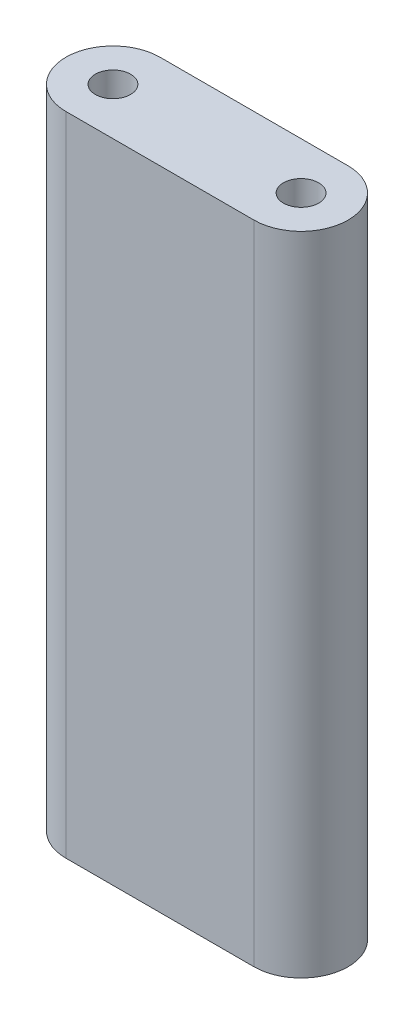
ISO-10303-21;
HEADER;
FILE_DESCRIPTION(('STEP AP214'),'2;1');
FILE_NAME('part.step','',(''),(''),'','','');
FILE_SCHEMA(('AUTOMOTIVE_DESIGN { 1 0 10303 214 1 1 1 1 }'));
ENDSEC;
DATA;
#1=APPLICATION_CONTEXT('core data for automotive mechanical design processes');
#2=APPLICATION_PROTOCOL_DEFINITION('international standard','automotive_design',2000,#1);
#3=PRODUCT_CONTEXT('',#1,'mechanical');
#4=PRODUCT('Part','Part','',(#3));
#5=PRODUCT_RELATED_PRODUCT_CATEGORY('part','',(#4));
#6=PRODUCT_DEFINITION_FORMATION('','',#4);
#7=PRODUCT_DEFINITION_CONTEXT('part definition',#1,'design');
#8=PRODUCT_DEFINITION('design','',#6,#7);
#9=PRODUCT_DEFINITION_SHAPE('','',#8);
#10=(LENGTH_UNIT() NAMED_UNIT(*) SI_UNIT(.MILLI.,.METRE.));
#11=(NAMED_UNIT(*) PLANE_ANGLE_UNIT() SI_UNIT($,.RADIAN.));
#12=(NAMED_UNIT(*) SI_UNIT($,.STERADIAN.) SOLID_ANGLE_UNIT());
#13=UNCERTAINTY_MEASURE_WITH_UNIT(LENGTH_MEASURE(1.E-05),#10,'distance_accuracy_value','');
#14=(GEOMETRIC_REPRESENTATION_CONTEXT(3) GLOBAL_UNCERTAINTY_ASSIGNED_CONTEXT((#13)) GLOBAL_UNIT_ASSIGNED_CONTEXT((#10,
#11,#12)) REPRESENTATION_CONTEXT('',''));
#15=CARTESIAN_POINT('',(0.,0.,0.));
#16=DIRECTION('',(0.,0.,1.));
#17=DIRECTION('',(1.,0.,0.));
#18=AXIS2_PLACEMENT_3D('',#15,#16,#17);
#19=CARTESIAN_POINT('',(-10.3736217176902,55.,0.));
#20=DIRECTION('',(0.,1.,0.));
#21=DIRECTION('',(0.,0.,1.));
#22=AXIS2_PLACEMENT_3D('',#19,#20,#21);
#23=PLANE('',#22);
#24=CARTESIAN_POINT('',(-10.3736217176902,55.,0.));
#25=DIRECTION('',(0.,1.,0.));
#26=DIRECTION('',(0.,0.,1.));
#27=AXIS2_PLACEMENT_3D('',#24,#25,#26);
#28=CIRCLE('',#27,1.5);
#29=CARTESIAN_POINT('',(-10.3736217176902,55.,1.5));
#30=VERTEX_POINT('',#29);
#31=EDGE_CURVE('E103',#30,#30,#28,.T.);
#32=ORIENTED_EDGE('',*,*,#31,.F.);
#33=EDGE_LOOP('',(#32));
#34=FACE_BOUND('',#33,.T.);
#35=CARTESIAN_POINT('',(-10.3736217176902,55.,0.));
#36=DIRECTION('',(0.,1.,0.));
#37=DIRECTION('',(0.,0.,1.));
#38=AXIS2_PLACEMENT_3D('',#35,#36,#37);
#39=CIRCLE('',#38,4.);
#40=CARTESIAN_POINT('',(-10.3736217176902,55.,-4.));
#41=VERTEX_POINT('',#40);
#42=CARTESIAN_POINT('',(-10.3736217176902,55.,4.));
#43=VERTEX_POINT('',#42);
#44=EDGE_CURVE('E88',#41,#43,#39,.T.);
#45=ORIENTED_EDGE('',*,*,#44,.T.);
#46=DIRECTION('',(1.,0.,0.));
#47=VECTOR('',#46,1.);
#48=CARTESIAN_POINT('',(-10.3736217176902,55.,4.));
#49=LINE('',#48,#47);
#50=CARTESIAN_POINT('',(5.62637828230982,55.,4.));
#51=VERTEX_POINT('',#50);
#52=EDGE_CURVE('E83',#43,#51,#49,.T.);
#53=ORIENTED_EDGE('',*,*,#52,.T.);
#54=CARTESIAN_POINT('',(5.62637828230982,55.,0.));
#55=DIRECTION('',(0.,1.,0.));
#56=DIRECTION('',(0.,0.,1.));
#57=AXIS2_PLACEMENT_3D('',#54,#55,#56);
#58=CIRCLE('',#57,4.);
#59=CARTESIAN_POINT('',(5.62637828230982,55.,-4.));
#60=VERTEX_POINT('',#59);
#61=EDGE_CURVE('E86',#51,#60,#58,.T.);
#62=ORIENTED_EDGE('',*,*,#61,.T.);
#63=DIRECTION('',(-1.,0.,0.));
#64=VECTOR('',#63,1.);
#65=CARTESIAN_POINT('',(-10.3736217176902,55.,-4.));
#66=LINE('',#65,#64);
#67=EDGE_CURVE('E53',#60,#41,#66,.T.);
#68=ORIENTED_EDGE('',*,*,#67,.T.);
#69=EDGE_LOOP('',(#45,#53,#62,#68));
#70=FACE_BOUND('',#69,.T.);
#71=CARTESIAN_POINT('',(5.62637828230982,55.,0.));
#72=DIRECTION('',(0.,1.,0.));
#73=DIRECTION('',(0.,0.,1.));
#74=AXIS2_PLACEMENT_3D('',#71,#72,#73);
#75=CIRCLE('',#74,1.5);
#76=CARTESIAN_POINT('',(5.62637828230982,55.,1.5));
#77=VERTEX_POINT('',#76);
#78=EDGE_CURVE('E118',#77,#77,#75,.T.);
#79=ORIENTED_EDGE('',*,*,#78,.F.);
#80=EDGE_LOOP('',(#79));
#81=FACE_BOUND('',#80,.T.);
#82=ADVANCED_FACE('F36',(#34,#70,#81),#23,.T.);
#83=CARTESIAN_POINT('',(-10.3736217176902,0.,0.));
#84=DIRECTION('',(0.,1.,0.));
#85=DIRECTION('',(0.,0.,1.));
#86=AXIS2_PLACEMENT_3D('',#83,#84,#85);
#87=PLANE('',#86);
#88=CARTESIAN_POINT('',(-10.3736217176902,0.,0.));
#89=DIRECTION('',(0.,1.,0.));
#90=DIRECTION('',(0.,0.,1.));
#91=AXIS2_PLACEMENT_3D('',#88,#89,#90);
#92=CIRCLE('',#91,4.);
#93=CARTESIAN_POINT('',(-10.3736217176902,0.,-4.));
#94=VERTEX_POINT('',#93);
#95=CARTESIAN_POINT('',(-10.3736217176902,0.,4.));
#96=VERTEX_POINT('',#95);
#97=EDGE_CURVE('E100',#94,#96,#92,.T.);
#98=ORIENTED_EDGE('',*,*,#97,.F.);
#99=DIRECTION('',(-1.,0.,0.));
#100=VECTOR('',#99,1.);
#101=CARTESIAN_POINT('',(-10.3736217176902,0.,-4.));
#102=LINE('',#101,#100);
#103=CARTESIAN_POINT('',(5.62637828230982,0.,-4.));
#104=VERTEX_POINT('',#103);
#105=EDGE_CURVE('E76',#104,#94,#102,.T.);
#106=ORIENTED_EDGE('',*,*,#105,.F.);
#107=CARTESIAN_POINT('',(5.62637828230982,0.,0.));
#108=DIRECTION('',(0.,1.,0.));
#109=DIRECTION('',(0.,0.,1.));
#110=AXIS2_PLACEMENT_3D('',#107,#108,#109);
#111=CIRCLE('',#110,4.);
#112=CARTESIAN_POINT('',(5.62637828230982,0.,4.));
#113=VERTEX_POINT('',#112);
#114=EDGE_CURVE('E70',#113,#104,#111,.T.);
#115=ORIENTED_EDGE('',*,*,#114,.F.);
#116=DIRECTION('',(1.,0.,0.));
#117=VECTOR('',#116,1.);
#118=CARTESIAN_POINT('',(-10.3736217176902,0.,4.));
#119=LINE('',#118,#117);
#120=EDGE_CURVE('E92',#96,#113,#119,.T.);
#121=ORIENTED_EDGE('',*,*,#120,.F.);
#122=EDGE_LOOP('',(#98,#106,#115,#121));
#123=FACE_BOUND('',#122,.T.);
#124=CARTESIAN_POINT('',(-10.3736217176902,0.,0.));
#125=DIRECTION('',(0.,1.,0.));
#126=DIRECTION('',(0.,0.,1.));
#127=AXIS2_PLACEMENT_3D('',#124,#125,#126);
#128=CIRCLE('',#127,1.5);
#129=CARTESIAN_POINT('',(-10.3736217176902,0.,1.5));
#130=VERTEX_POINT('',#129);
#131=EDGE_CURVE('E115',#130,#130,#128,.T.);
#132=ORIENTED_EDGE('',*,*,#131,.T.);
#133=EDGE_LOOP('',(#132));
#134=FACE_BOUND('',#133,.T.);
#135=CARTESIAN_POINT('',(5.62637828230982,0.,0.));
#136=DIRECTION('',(0.,1.,0.));
#137=DIRECTION('',(0.,0.,1.));
#138=AXIS2_PLACEMENT_3D('',#135,#136,#137);
#139=CIRCLE('',#138,1.5);
#140=CARTESIAN_POINT('',(5.62637828230982,0.,1.5));
#141=VERTEX_POINT('',#140);
#142=EDGE_CURVE('E121',#141,#141,#139,.T.);
#143=ORIENTED_EDGE('',*,*,#142,.T.);
#144=EDGE_LOOP('',(#143));
#145=FACE_BOUND('',#144,.T.);
#146=ADVANCED_FACE('F111',(#123,#134,#145),#87,.F.);
#147=CARTESIAN_POINT('',(-10.3736217176902,55.,0.));
#148=DIRECTION('',(0.,-1.,0.));
#149=DIRECTION('',(0.,0.,-1.));
#150=AXIS2_PLACEMENT_3D('',#147,#148,#149);
#151=CYLINDRICAL_SURFACE('',#150,4.);
#152=ORIENTED_EDGE('',*,*,#97,.T.);
#153=DIRECTION('',(0.,-1.,0.));
#154=VECTOR('',#153,1.);
#155=CARTESIAN_POINT('',(-10.3736217176902,55.,4.));
#156=LINE('',#155,#154);
#157=EDGE_CURVE('E11',#43,#96,#156,.T.);
#158=ORIENTED_EDGE('',*,*,#157,.F.);
#159=ORIENTED_EDGE('',*,*,#44,.F.);
#160=DIRECTION('',(0.,-1.,0.));
#161=VECTOR('',#160,1.);
#162=CARTESIAN_POINT('',(-10.3736217176902,55.,-4.));
#163=LINE('',#162,#161);
#164=EDGE_CURVE('E96',#41,#94,#163,.T.);
#165=ORIENTED_EDGE('',*,*,#164,.T.);
#166=EDGE_LOOP('',(#152,#158,#159,#165));
#167=FACE_BOUND('',#166,.T.);
#168=ADVANCED_FACE('F38',(#167),#151,.T.);
#169=CARTESIAN_POINT('',(-10.3736217176902,55.,4.));
#170=DIRECTION('',(0.,0.,-1.));
#171=DIRECTION('',(-1.,0.,0.));
#172=AXIS2_PLACEMENT_3D('',#169,#170,#171);
#173=PLANE('',#172);
#174=ORIENTED_EDGE('',*,*,#120,.T.);
#175=DIRECTION('',(0.,-1.,0.));
#176=VECTOR('',#175,1.);
#177=CARTESIAN_POINT('',(5.62637828230982,55.,4.));
#178=LINE('',#177,#176);
#179=EDGE_CURVE('E45',#51,#113,#178,.T.);
#180=ORIENTED_EDGE('',*,*,#179,.F.);
#181=ORIENTED_EDGE('',*,*,#52,.F.);
#182=ORIENTED_EDGE('',*,*,#157,.T.);
#183=EDGE_LOOP('',(#174,#180,#181,#182));
#184=FACE_BOUND('',#183,.T.);
#185=ADVANCED_FACE('F91',(#184),#173,.F.);
#186=CARTESIAN_POINT('',(5.62637828230982,55.,0.));
#187=DIRECTION('',(0.,-1.,0.));
#188=DIRECTION('',(0.,0.,-1.));
#189=AXIS2_PLACEMENT_3D('',#186,#187,#188);
#190=CYLINDRICAL_SURFACE('',#189,4.);
#191=ORIENTED_EDGE('',*,*,#114,.T.);
#192=DIRECTION('',(0.,-1.,0.));
#193=VECTOR('',#192,1.);
#194=CARTESIAN_POINT('',(5.62637828230982,55.,-4.));
#195=LINE('',#194,#193);
#196=EDGE_CURVE('E93',#60,#104,#195,.T.);
#197=ORIENTED_EDGE('',*,*,#196,.F.);
#198=ORIENTED_EDGE('',*,*,#61,.F.);
#199=ORIENTED_EDGE('',*,*,#179,.T.);
#200=EDGE_LOOP('',(#191,#197,#198,#199));
#201=FACE_BOUND('',#200,.T.);
#202=ADVANCED_FACE('F94',(#201),#190,.T.);
#203=CARTESIAN_POINT('',(-10.3736217176902,55.,-4.));
#204=DIRECTION('',(0.,0.,1.));
#205=DIRECTION('',(1.,0.,0.));
#206=AXIS2_PLACEMENT_3D('',#203,#204,#205);
#207=PLANE('',#206);
#208=ORIENTED_EDGE('',*,*,#105,.T.);
#209=ORIENTED_EDGE('',*,*,#164,.F.);
#210=ORIENTED_EDGE('',*,*,#67,.F.);
#211=ORIENTED_EDGE('',*,*,#196,.T.);
#212=EDGE_LOOP('',(#208,#209,#210,#211));
#213=FACE_BOUND('',#212,.T.);
#214=ADVANCED_FACE('F108',(#213),#207,.F.);
#215=CARTESIAN_POINT('',(-10.3736217176902,55.,0.));
#216=DIRECTION('',(0.,-1.,0.));
#217=DIRECTION('',(0.,0.,-1.));
#218=AXIS2_PLACEMENT_3D('',#215,#216,#217);
#219=CYLINDRICAL_SURFACE('',#218,1.5);
#220=ORIENTED_EDGE('',*,*,#31,.T.);
#221=EDGE_LOOP('',(#220));
#222=FACE_BOUND('',#221,.T.);
#223=ORIENTED_EDGE('',*,*,#131,.F.);
#224=EDGE_LOOP('',(#223));
#225=FACE_BOUND('',#224,.T.);
#226=ADVANCED_FACE('F138',(#222,#225),#219,.F.);
#227=CARTESIAN_POINT('',(5.62637828230982,55.,0.));
#228=DIRECTION('',(0.,-1.,0.));
#229=DIRECTION('',(0.,0.,-1.));
#230=AXIS2_PLACEMENT_3D('',#227,#228,#229);
#231=CYLINDRICAL_SURFACE('',#230,1.5);
#232=ORIENTED_EDGE('',*,*,#78,.T.);
#233=EDGE_LOOP('',(#232));
#234=FACE_BOUND('',#233,.T.);
#235=ORIENTED_EDGE('',*,*,#142,.F.);
#236=EDGE_LOOP('',(#235));
#237=FACE_BOUND('',#236,.T.);
#238=ADVANCED_FACE('F127',(#234,#237),#231,.F.);
#239=CLOSED_SHELL('',(#82,#146,#168,#185,#202,#214,#226,#238));
#240=MANIFOLD_SOLID_BREP('B2',#239);
#241=ADVANCED_BREP_SHAPE_REPRESENTATION('',(#18,#240),#14);
#242=SHAPE_DEFINITION_REPRESENTATION(#9,#241);
ENDSEC;
END-ISO-10303-21;
